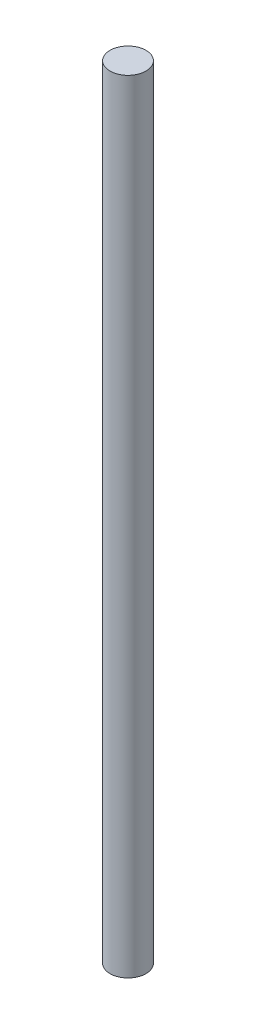
ISO-10303-21;
HEADER;
FILE_DESCRIPTION(('STEP AP214'),'2;1');
FILE_NAME('part.step','',(''),(''),'','','');
FILE_SCHEMA(('AUTOMOTIVE_DESIGN { 1 0 10303 214 1 1 1 1 }'));
ENDSEC;
DATA;
#1=APPLICATION_CONTEXT('core data for automotive mechanical design processes');
#2=APPLICATION_PROTOCOL_DEFINITION('international standard','automotive_design',2000,#1);
#3=PRODUCT_CONTEXT('',#1,'mechanical');
#4=PRODUCT('Part','Part','',(#3));
#5=PRODUCT_RELATED_PRODUCT_CATEGORY('part','',(#4));
#6=PRODUCT_DEFINITION_FORMATION('','',#4);
#7=PRODUCT_DEFINITION_CONTEXT('part definition',#1,'design');
#8=PRODUCT_DEFINITION('design','',#6,#7);
#9=PRODUCT_DEFINITION_SHAPE('','',#8);
#10=(LENGTH_UNIT() NAMED_UNIT(*) SI_UNIT(.MILLI.,.METRE.));
#11=(NAMED_UNIT(*) PLANE_ANGLE_UNIT() SI_UNIT($,.RADIAN.));
#12=(NAMED_UNIT(*) SI_UNIT($,.STERADIAN.) SOLID_ANGLE_UNIT());
#13=UNCERTAINTY_MEASURE_WITH_UNIT(LENGTH_MEASURE(1.E-05),#10,'distance_accuracy_value','');
#14=(GEOMETRIC_REPRESENTATION_CONTEXT(3) GLOBAL_UNCERTAINTY_ASSIGNED_CONTEXT((#13)) GLOBAL_UNIT_ASSIGNED_CONTEXT((#10,
#11,#12)) REPRESENTATION_CONTEXT('',''));
#15=CARTESIAN_POINT('',(0.,0.,0.));
#16=DIRECTION('',(0.,0.,1.));
#17=DIRECTION('',(1.,0.,0.));
#18=AXIS2_PLACEMENT_3D('',#15,#16,#17);
#19=CARTESIAN_POINT('',(0.,76.2,0.));
#20=DIRECTION('',(0.,-1.,0.));
#21=DIRECTION('',(0.,0.,-1.));
#22=AXIS2_PLACEMENT_3D('',#19,#20,#21);
#23=CYLINDRICAL_SURFACE('',#22,1.7526);
#24=CARTESIAN_POINT('',(0.,76.2,0.));
#25=DIRECTION('',(0.,1.,0.));
#26=DIRECTION('',(0.,0.,1.));
#27=AXIS2_PLACEMENT_3D('',#24,#25,#26);
#28=CIRCLE('',#27,1.7526);
#29=CARTESIAN_POINT('',(0.,76.2,-1.7526));
#30=VERTEX_POINT('',#29);
#31=EDGE_CURVE('E10',#30,#30,#28,.T.);
#32=CARTESIAN_POINT('',(0.,0.,0.));
#33=DIRECTION('',(0.,1.,0.));
#34=DIRECTION('',(0.,0.,1.));
#35=AXIS2_PLACEMENT_3D('',#32,#33,#34);
#36=CIRCLE('',#35,1.7526);
#37=CARTESIAN_POINT('',(0.,0.,-1.7526));
#38=VERTEX_POINT('',#37);
#39=EDGE_CURVE('E38',#38,#38,#36,.T.);
#40=CARTESIAN_POINT('',(0.,76.2,-1.7526));
#41=CARTESIAN_POINT('',(0.,75.40625,-1.7526));
#42=CARTESIAN_POINT('',(0.,74.6125,-1.7526));
#43=CARTESIAN_POINT('',(0.,73.025,-1.7526));
#44=CARTESIAN_POINT('',(0.,72.23125,-1.7526));
#45=CARTESIAN_POINT('',(0.,70.64375,-1.7526));
#46=CARTESIAN_POINT('',(0.,69.85,-1.7526));
#47=CARTESIAN_POINT('',(0.,68.2625,-1.7526));
#48=CARTESIAN_POINT('',(0.,67.46875,-1.7526));
#49=CARTESIAN_POINT('',(0.,65.88125,-1.7526));
#50=CARTESIAN_POINT('',(0.,65.0875,-1.7526));
#51=CARTESIAN_POINT('',(0.,63.5,-1.7526));
#52=CARTESIAN_POINT('',(0.,62.70625,-1.7526));
#53=CARTESIAN_POINT('',(0.,61.11875,-1.7526));
#54=CARTESIAN_POINT('',(0.,60.325,-1.7526));
#55=CARTESIAN_POINT('',(0.,58.7375,-1.7526));
#56=CARTESIAN_POINT('',(0.,57.94375,-1.7526));
#57=CARTESIAN_POINT('',(0.,56.35625,-1.7526));
#58=CARTESIAN_POINT('',(0.,55.5625,-1.7526));
#59=CARTESIAN_POINT('',(0.,53.975,-1.7526));
#60=CARTESIAN_POINT('',(0.,53.18125,-1.7526));
#61=CARTESIAN_POINT('',(0.,51.59375,-1.7526));
#62=CARTESIAN_POINT('',(0.,50.8,-1.7526));
#63=CARTESIAN_POINT('',(0.,49.2125,-1.7526));
#64=CARTESIAN_POINT('',(0.,48.41875,-1.7526));
#65=CARTESIAN_POINT('',(0.,46.83125,-1.7526));
#66=CARTESIAN_POINT('',(0.,46.0375,-1.7526));
#67=CARTESIAN_POINT('',(0.,44.45,-1.7526));
#68=CARTESIAN_POINT('',(0.,43.65625,-1.7526));
#69=CARTESIAN_POINT('',(0.,42.06875,-1.7526));
#70=CARTESIAN_POINT('',(0.,41.275,-1.7526));
#71=CARTESIAN_POINT('',(0.,39.6875,-1.7526));
#72=CARTESIAN_POINT('',(0.,38.89375,-1.7526));
#73=CARTESIAN_POINT('',(0.,37.30625,-1.7526));
#74=CARTESIAN_POINT('',(0.,36.5125,-1.7526));
#75=CARTESIAN_POINT('',(0.,34.925,-1.7526));
#76=CARTESIAN_POINT('',(0.,34.13125,-1.7526));
#77=CARTESIAN_POINT('',(0.,32.54375,-1.7526));
#78=CARTESIAN_POINT('',(0.,31.75,-1.7526));
#79=CARTESIAN_POINT('',(0.,30.1625,-1.7526));
#80=CARTESIAN_POINT('',(0.,29.36875,-1.7526));
#81=CARTESIAN_POINT('',(0.,27.78125,-1.7526));
#82=CARTESIAN_POINT('',(0.,26.9875,-1.7526));
#83=CARTESIAN_POINT('',(0.,25.4,-1.7526));
#84=CARTESIAN_POINT('',(0.,24.60625,-1.7526));
#85=CARTESIAN_POINT('',(0.,23.01875,-1.7526));
#86=CARTESIAN_POINT('',(0.,22.225,-1.7526));
#87=CARTESIAN_POINT('',(0.,20.6375,-1.7526));
#88=CARTESIAN_POINT('',(0.,19.84375,-1.7526));
#89=CARTESIAN_POINT('',(0.,18.25625,-1.7526));
#90=CARTESIAN_POINT('',(0.,17.4625,-1.7526));
#91=CARTESIAN_POINT('',(0.,15.875,-1.7526));
#92=CARTESIAN_POINT('',(0.,15.08125,-1.7526));
#93=CARTESIAN_POINT('',(0.,13.49375,-1.7526));
#94=CARTESIAN_POINT('',(0.,12.7,-1.7526));
#95=CARTESIAN_POINT('',(0.,11.1125,-1.7526));
#96=CARTESIAN_POINT('',(0.,10.31875,-1.7526));
#97=CARTESIAN_POINT('',(0.,8.73125,-1.7526));
#98=CARTESIAN_POINT('',(0.,7.93750000000001,-1.7526));
#99=CARTESIAN_POINT('',(0.,6.35,-1.7526));
#100=CARTESIAN_POINT('',(0.,5.55625,-1.7526));
#101=CARTESIAN_POINT('',(0.,3.96875,-1.7526));
#102=CARTESIAN_POINT('',(0.,3.175,-1.7526));
#103=CARTESIAN_POINT('',(0.,1.5875,-1.7526));
#104=CARTESIAN_POINT('',(0.,0.793750000000001,-1.7526));
#105=CARTESIAN_POINT('',(0.,0.,-1.7526));
#106=B_SPLINE_CURVE_WITH_KNOTS('',3,(#40,#41,#42,#43,#44,#45,#46,#47,#48,#49,#50,#51,#52,#53,
#54,#55,#56,#57,#58,#59,#60,#61,#62,#63,#64,#65,#66,#67,#68,#69,#70,#71,#72,#73,#74,#75,#76,#77,
#78,#79,#80,#81,#82,#83,#84,#85,#86,#87,#88,#89,#90,#91,#92,#93,#94,#95,#96,#97,#98,#99,#100,
#101,#102,#103,#104,#105),.UNSPECIFIED.,.F.,.F.,(4,2,2,2,2,2,2,2,2,2,2,2,2,2,2,2,2,2,2,2,2,2,2,
2,2,2,2,2,2,2,2,2,4),(0.,2.38125,4.7625,7.14375,9.52500000000001,11.90625,14.2875,16.66875,
19.05,21.43125,23.8125,26.19375,28.575,30.95625,33.3375,35.71875,38.1,40.48125,42.8625,45.24375,
47.625,50.00625,52.3875,54.76875,57.15,59.53125,61.9125,64.29375,66.675,69.05625,71.4375,
73.81875,76.2),.UNSPECIFIED.);
#107=EDGE_CURVE('BSEAM35',#30,#38,#106,.T.);
#108=ORIENTED_EDGE('',*,*,#31,.F.);
#109=ORIENTED_EDGE('',*,*,#39,.T.);
#110=ORIENTED_EDGE('',*,*,#107,.T.);
#111=ORIENTED_EDGE('',*,*,#107,.F.);
#112=EDGE_LOOP('',(#108,#110,#109,#111));
#113=FACE_BOUND('',#112,.T.);
#114=ADVANCED_FACE('F35',(#113),#23,.T.);
#115=CARTESIAN_POINT('',(0.,76.2,0.));
#116=DIRECTION('',(0.,1.,0.));
#117=DIRECTION('',(0.,0.,1.));
#118=AXIS2_PLACEMENT_3D('',#115,#116,#117);
#119=PLANE('',#118);
#120=ORIENTED_EDGE('',*,*,#31,.T.);
#121=EDGE_LOOP('',(#120));
#122=FACE_BOUND('',#121,.T.);
#123=ADVANCED_FACE('F50',(#122),#119,.T.);
#124=CARTESIAN_POINT('',(0.,0.,0.));
#125=DIRECTION('',(0.,1.,0.));
#126=DIRECTION('',(0.,0.,1.));
#127=AXIS2_PLACEMENT_3D('',#124,#125,#126);
#128=PLANE('',#127);
#129=ORIENTED_EDGE('',*,*,#39,.F.);
#130=EDGE_LOOP('',(#129));
#131=FACE_BOUND('',#130,.T.);
#132=ADVANCED_FACE('F48',(#131),#128,.F.);
#133=CLOSED_SHELL('',(#114,#123,#132));
#134=MANIFOLD_SOLID_BREP('B2',#133);
#135=ADVANCED_BREP_SHAPE_REPRESENTATION('',(#18,#134),#14);
#136=SHAPE_DEFINITION_REPRESENTATION(#9,#135);
ENDSEC;
END-ISO-10303-21;
